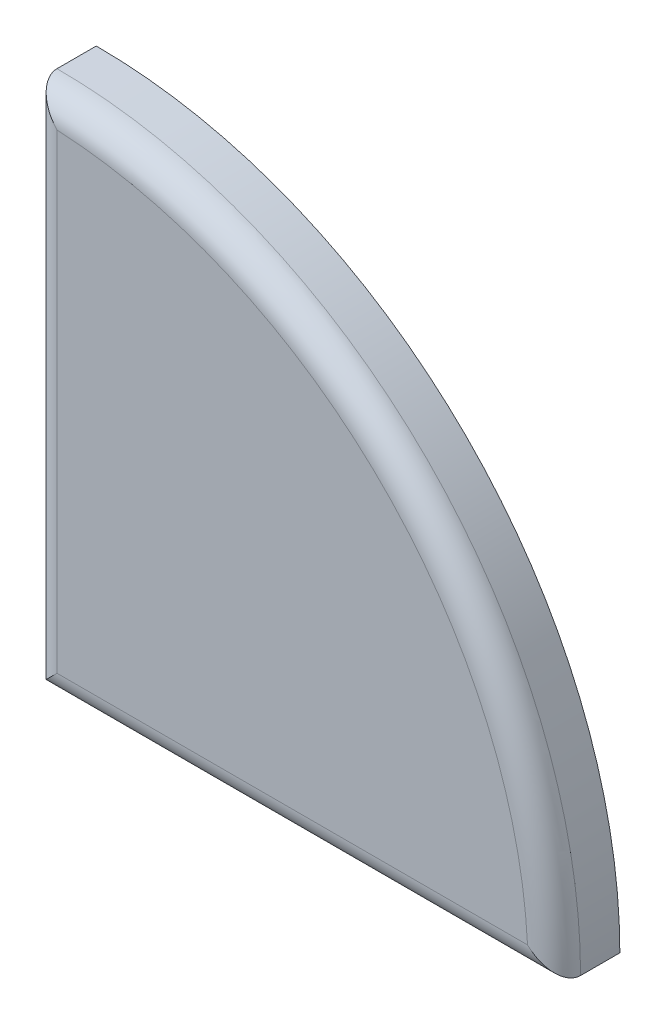
ISO-10303-21;
HEADER;
FILE_DESCRIPTION(('STEP AP214'),'2;1');
FILE_NAME('part.step','',(''),(''),'','','');
FILE_SCHEMA(('AUTOMOTIVE_DESIGN { 1 0 10303 214 1 1 1 1 }'));
ENDSEC;
DATA;
#1=APPLICATION_CONTEXT('core data for automotive mechanical design processes');
#2=APPLICATION_PROTOCOL_DEFINITION('international standard','automotive_design',2000,#1);
#3=PRODUCT_CONTEXT('',#1,'mechanical');
#4=PRODUCT('Part','Part','',(#3));
#5=PRODUCT_RELATED_PRODUCT_CATEGORY('part','',(#4));
#6=PRODUCT_DEFINITION_FORMATION('','',#4);
#7=PRODUCT_DEFINITION_CONTEXT('part definition',#1,'design');
#8=PRODUCT_DEFINITION('design','',#6,#7);
#9=PRODUCT_DEFINITION_SHAPE('','',#8);
#10=(LENGTH_UNIT() NAMED_UNIT(*) SI_UNIT(.MILLI.,.METRE.));
#11=(NAMED_UNIT(*) PLANE_ANGLE_UNIT() SI_UNIT($,.RADIAN.));
#12=(NAMED_UNIT(*) SI_UNIT($,.STERADIAN.) SOLID_ANGLE_UNIT());
#13=UNCERTAINTY_MEASURE_WITH_UNIT(LENGTH_MEASURE(1.E-05),#10,'distance_accuracy_value','');
#14=(GEOMETRIC_REPRESENTATION_CONTEXT(3) GLOBAL_UNCERTAINTY_ASSIGNED_CONTEXT((#13)) GLOBAL_UNIT_ASSIGNED_CONTEXT((#10,
#11,#12)) REPRESENTATION_CONTEXT('',''));
#15=CARTESIAN_POINT('',(0.,0.,0.));
#16=DIRECTION('',(0.,0.,1.));
#17=DIRECTION('',(1.,0.,0.));
#18=AXIS2_PLACEMENT_3D('',#15,#16,#17);
#19=CARTESIAN_POINT('',(-20.,-20.,5.));
#20=DIRECTION('',(0.,0.,-1.));
#21=DIRECTION('',(-1.,0.,0.));
#22=AXIS2_PLACEMENT_3D('',#19,#20,#21);
#23=CYLINDRICAL_SURFACE('',#22,40.);
#24=DIRECTION('',(0.,0.,-1.));
#25=VECTOR('',#24,1.);
#26=CARTESIAN_POINT('',(-20.,20.,5.));
#27=LINE('',#26,#25);
#28=CARTESIAN_POINT('',(-20.,20.,3.));
#29=VERTEX_POINT('',#28);
#30=CARTESIAN_POINT('',(-20.,20.,0.));
#31=VERTEX_POINT('',#30);
#32=EDGE_CURVE('E41',#29,#31,#27,.T.);
#33=ORIENTED_EDGE('',*,*,#32,.F.);
#34=CARTESIAN_POINT('',(-20.,-20.,3.));
#35=DIRECTION('',(0.,0.,-1.));
#36=DIRECTION('',(-1.,0.,0.));
#37=AXIS2_PLACEMENT_3D('',#34,#35,#36);
#38=CIRCLE('',#37,40.);
#39=CARTESIAN_POINT('',(20.,-20.,3.));
#40=VERTEX_POINT('',#39);
#41=EDGE_CURVE('E11',#29,#40,#38,.T.);
#42=ORIENTED_EDGE('',*,*,#41,.T.);
#43=DIRECTION('',(0.,0.,-1.));
#44=VECTOR('',#43,1.);
#45=CARTESIAN_POINT('',(20.,-20.,5.));
#46=LINE('',#45,#44);
#47=CARTESIAN_POINT('',(20.,-20.,0.));
#48=VERTEX_POINT('',#47);
#49=EDGE_CURVE('E28',#40,#48,#46,.T.);
#50=ORIENTED_EDGE('',*,*,#49,.T.);
#51=CARTESIAN_POINT('',(-20.,-20.,0.));
#52=DIRECTION('',(0.,0.,1.));
#53=DIRECTION('',(-1.,0.,0.));
#54=AXIS2_PLACEMENT_3D('',#51,#52,#53);
#55=CIRCLE('',#54,40.);
#56=EDGE_CURVE('E93',#48,#31,#55,.T.);
#57=ORIENTED_EDGE('',*,*,#56,.T.);
#58=EDGE_LOOP('',(#33,#42,#50,#57));
#59=FACE_BOUND('',#58,.T.);
#60=ADVANCED_FACE('F16',(#59),#23,.T.);
#61=CARTESIAN_POINT('',(-20.,-20.,5.));
#62=DIRECTION('',(1.,0.,0.));
#63=DIRECTION('',(0.,1.,0.));
#64=AXIS2_PLACEMENT_3D('',#61,#62,#63);
#65=PLANE('',#64);
#66=DIRECTION('',(0.,0.,-1.));
#67=VECTOR('',#66,1.);
#68=CARTESIAN_POINT('',(-20.,-20.,5.));
#69=LINE('',#68,#67);
#70=CARTESIAN_POINT('',(-20.,-20.,3.));
#71=VERTEX_POINT('',#70);
#72=CARTESIAN_POINT('',(-20.,-20.,0.));
#73=VERTEX_POINT('',#72);
#74=EDGE_CURVE('E75',#71,#73,#69,.T.);
#75=ORIENTED_EDGE('',*,*,#74,.F.);
#76=DIRECTION('',(0.,1.,0.));
#77=VECTOR('',#76,1.);
#78=CARTESIAN_POINT('',(-20.,-20.,3.));
#79=LINE('',#78,#77);
#80=EDGE_CURVE('E356',#71,#29,#79,.T.);
#81=ORIENTED_EDGE('',*,*,#80,.T.);
#82=ORIENTED_EDGE('',*,*,#32,.T.);
#83=DIRECTION('',(0.,-1.,0.));
#84=VECTOR('',#83,1.);
#85=CARTESIAN_POINT('',(-20.,-20.,0.));
#86=LINE('',#85,#84);
#87=EDGE_CURVE('E87',#31,#73,#86,.T.);
#88=ORIENTED_EDGE('',*,*,#87,.T.);
#89=EDGE_LOOP('',(#75,#81,#82,#88));
#90=FACE_BOUND('',#89,.T.);
#91=ADVANCED_FACE('F88',(#90),#65,.F.);
#92=CARTESIAN_POINT('',(20.,-20.,5.));
#93=DIRECTION('',(0.,1.,0.));
#94=DIRECTION('',(1.,0.,0.));
#95=AXIS2_PLACEMENT_3D('',#92,#93,#94);
#96=PLANE('',#95);
#97=ORIENTED_EDGE('',*,*,#49,.F.);
#98=DIRECTION('',(-1.,0.,0.));
#99=VECTOR('',#98,1.);
#100=CARTESIAN_POINT('',(20.,-20.,3.));
#101=LINE('',#100,#99);
#102=EDGE_CURVE('E81',#40,#71,#101,.T.);
#103=ORIENTED_EDGE('',*,*,#102,.T.);
#104=ORIENTED_EDGE('',*,*,#74,.T.);
#105=DIRECTION('',(1.,0.,0.));
#106=VECTOR('',#105,1.);
#107=CARTESIAN_POINT('',(20.,-20.,0.));
#108=LINE('',#107,#106);
#109=EDGE_CURVE('E80',#73,#48,#108,.T.);
#110=ORIENTED_EDGE('',*,*,#109,.T.);
#111=EDGE_LOOP('',(#97,#103,#104,#110));
#112=FACE_BOUND('',#111,.T.);
#113=ADVANCED_FACE('F78',(#112),#96,.F.);
#114=CARTESIAN_POINT('',(-20.,-20.,5.));
#115=DIRECTION('',(0.,0.,-1.));
#116=DIRECTION('',(0.,-1.,0.));
#117=AXIS2_PLACEMENT_3D('',#114,#115,#116);
#118=PLANE('',#117);
#119=DIRECTION('',(0.,-1.,0.));
#120=VECTOR('',#119,1.);
#121=CARTESIAN_POINT('',(-18.,-20.,5.));
#122=LINE('',#121,#120);
#123=CARTESIAN_POINT('',(-18.,17.9473319220205,5.));
#124=VERTEX_POINT('',#123);
#125=CARTESIAN_POINT('',(-18.,-18.,5.));
#126=VERTEX_POINT('',#125);
#127=EDGE_CURVE('E96',#124,#126,#122,.T.);
#128=ORIENTED_EDGE('',*,*,#127,.T.);
#129=DIRECTION('',(1.,0.,0.));
#130=VECTOR('',#129,1.);
#131=CARTESIAN_POINT('',(-20.,-18.,5.));
#132=LINE('',#131,#130);
#133=CARTESIAN_POINT('',(17.9473319220205,-18.,5.));
#134=VERTEX_POINT('',#133);
#135=EDGE_CURVE('E103',#126,#134,#132,.T.);
#136=ORIENTED_EDGE('',*,*,#135,.T.);
#137=CARTESIAN_POINT('',(-20.,-20.,5.));
#138=DIRECTION('',(0.,0.,1.));
#139=DIRECTION('',(-1.,0.,0.));
#140=AXIS2_PLACEMENT_3D('',#137,#138,#139);
#141=CIRCLE('',#140,38.);
#142=EDGE_CURVE('E150',#134,#124,#141,.T.);
#143=ORIENTED_EDGE('',*,*,#142,.T.);
#144=EDGE_LOOP('',(#128,#136,#143));
#145=FACE_BOUND('',#144,.T.);
#146=ADVANCED_FACE('F127',(#145),#118,.F.);
#147=CARTESIAN_POINT('',(-20.,-20.,0.));
#148=DIRECTION('',(0.,0.,-1.));
#149=DIRECTION('',(0.,-1.,0.));
#150=AXIS2_PLACEMENT_3D('',#147,#148,#149);
#151=PLANE('',#150);
#152=ORIENTED_EDGE('',*,*,#56,.F.);
#153=ORIENTED_EDGE('',*,*,#109,.F.);
#154=ORIENTED_EDGE('',*,*,#87,.F.);
#155=EDGE_LOOP('',(#152,#153,#154));
#156=FACE_BOUND('',#155,.T.);
#157=ADVANCED_FACE('F92',(#156),#151,.T.);
#158=CARTESIAN_POINT('',(-18.,-20.,3.));
#159=DIRECTION('',(0.,-1.,0.));
#160=DIRECTION('',(0.,0.,-1.));
#161=AXIS2_PLACEMENT_3D('',#158,#159,#160);
#162=CYLINDRICAL_SURFACE('',#161,2.);
#163=CARTESIAN_POINT('',(-18.,-18.,5.));
#164=CARTESIAN_POINT('',(-19.1715728752538,-19.1715728752538,5.00000000000001));
#165=CARTESIAN_POINT('',(-20.,-20.,4.17157287525381));
#166=CARTESIAN_POINT('',(-20.,-20.,3.));
#167=(BOUNDED_CURVE() B_SPLINE_CURVE(3,(#163,#164,#165,#166),.UNSPECIFIED.,.F.,
.F.) B_SPLINE_CURVE_WITH_KNOTS((4,4),(4.71238898038469,6.28318530717959),
.UNSPECIFIED.) CURVE() GEOMETRIC_REPRESENTATION_ITEM() RATIONAL_B_SPLINE_CURVE((1.,
0.804737854124365,0.804737854124365,1.)) REPRESENTATION_ITEM(''));
#168=EDGE_CURVE('E163',#126,#71,#167,.T.);
#169=ORIENTED_EDGE('',*,*,#168,.F.);
#170=ORIENTED_EDGE('',*,*,#127,.F.);
#171=CARTESIAN_POINT('',(-20.0000000000001,20.,3.));
#172=CARTESIAN_POINT('',(-20.0000003530414,20.000000401746,3.01922782404628));
#173=CARTESIAN_POINT('',(-19.9997189131085,19.9997227338852,3.0384554570293));
#174=CARTESIAN_POINT('',(-19.9985964164672,19.9986127672637,3.07692685774793));
#175=CARTESIAN_POINT('',(-19.9977539532661,19.9977790745332,3.09617054432251));
#176=CARTESIAN_POINT('',(-19.9955096741128,19.9955548697261,3.13465785350083));
#177=CARTESIAN_POINT('',(-19.9941059931842,19.9941625010642,3.15390125978837));
#178=CARTESIAN_POINT('',(-19.9907401948945,19.9908197417427,3.19237188352495));
#179=CARTESIAN_POINT('',(-19.98877577393,19.9888670490109,3.21159869906074));
#180=CARTESIAN_POINT('',(-19.9842893924962,19.9844026662456,3.25001990455247));
#181=CARTESIAN_POINT('',(-19.9817647120339,19.9818882486913,3.26921365945341));
#182=CARTESIAN_POINT('',(-19.9761588645809,19.9762998742359,3.30755245774012));
#183=CARTESIAN_POINT('',(-19.9730745879879,19.9732227898799,3.32669658987219));
#184=CARTESIAN_POINT('',(-19.9663507051737,19.9665089197757,3.36491980272752));
#185=CARTESIAN_POINT('',(-19.9627076294995,19.9628686359397,3.38399765778847));
#186=CARTESIAN_POINT('',(-19.9548674189808,19.9550286017776,3.42207193565066));
#187=CARTESIAN_POINT('',(-19.9506664871833,19.9508250154582,3.44106678556811));
#188=CARTESIAN_POINT('',(-19.9417119418676,19.9418590066641,3.47895863929594));
#189=CARTESIAN_POINT('',(-19.9369542380451,19.937092445603,3.49785369584799));
#190=CARTESIAN_POINT('',(-19.9268876315531,19.9270015169631,3.53552952546439));
#191=CARTESIAN_POINT('',(-19.9215743805146,19.9216727453949,3.55430795553573));
#192=CARTESIAN_POINT('',(-19.9103982649792,19.9104588278391,3.59173407998057));
#193=CARTESIAN_POINT('',(-19.9045308298005,19.9045690507987,3.6103790200202));
#194=CARTESIAN_POINT('',(-19.8922480335532,19.8922349595548,3.64752170871918));
#195=CARTESIAN_POINT('',(-19.8858279151198,19.8857858260368,3.6660162817041));
#196=CARTESIAN_POINT('',(-19.8724415347049,19.8723352714667,3.70284178047072));
#197=CARTESIAN_POINT('',(-19.865470363567,19.865328881522,3.72116910447644));
#198=CARTESIAN_POINT('',(-19.8509837751553,19.8507664670058,3.75764368518888));
#199=CARTESIAN_POINT('',(-19.8434633308987,19.843205361807,3.77578691444813));
#200=CARTESIAN_POINT('',(-19.8278801249945,19.8275366265757,3.81187683653801));
#201=CARTESIAN_POINT('',(-19.8198122500605,19.8194238413863,3.82981908011604));
#202=CARTESIAN_POINT('',(-19.8031364542458,19.8026551289602,3.86549088846551));
#203=CARTESIAN_POINT('',(-19.794523366982,19.7939940055417,3.88321559415834));
#204=CARTESIAN_POINT('',(-19.778280853032,19.7776635157122,3.9154171487041));
#205=CARTESIAN_POINT('',(-19.7707153660614,19.7700580267246,3.92995876529487));
#206=CARTESIAN_POINT('',(-19.7551875492616,19.7544480089341,3.95892812524978));
#207=CARTESIAN_POINT('',(-19.7472211732077,19.7464394111451,3.97335149879901));
#208=CARTESIAN_POINT('',(-19.7225570552454,19.7216398108257,4.01673632721694));
#209=CARTESIAN_POINT('',(-19.7054109327426,19.7043930884818,4.04518588922929));
#210=CARTESIAN_POINT('',(-19.6695657669917,19.6683073510316,4.10150626253239));
#211=CARTESIAN_POINT('',(-19.6508364055032,19.6494369780575,4.12933752115913));
#212=CARTESIAN_POINT('',(-19.6118358074021,19.6101002986542,4.18432813255376));
#213=CARTESIAN_POINT('',(-19.5915357684464,19.5896037567479,4.21144538536442));
#214=CARTESIAN_POINT('',(-19.5494074895562,19.5470181186065,4.26490941765051));
#215=CARTESIAN_POINT('',(-19.5275521162227,19.5249002046236,4.29121178054695));
#216=CARTESIAN_POINT('',(-19.4823274221411,19.4790802213692,4.34294652243371));
#217=CARTESIAN_POINT('',(-19.4589326792866,19.4553509367873,4.36833250531974));
#218=CARTESIAN_POINT('',(-19.4106441774729,19.4063232333309,4.418132772932));
#219=CARTESIAN_POINT('',(-19.3857267134045,19.3809993871215,4.442498953204));
#220=CARTESIAN_POINT('',(-19.3344100197857,19.3288017616622,4.49015850778918));
#221=CARTESIAN_POINT('',(-19.3079888241711,19.3019044197295,4.51340238898703));
#222=CARTESIAN_POINT('',(-19.2596127678186,19.2526385492704,4.55375748646061));
#223=CARTESIAN_POINT('',(-19.2377847577049,19.2304026481904,4.57118416572252));
#224=CARTESIAN_POINT('',(-19.1929529162002,19.1847049797378,4.6054763456639));
#225=CARTESIAN_POINT('',(-19.1699345066273,19.161227392668,4.62230170697647));
#226=CARTESIAN_POINT('',(-19.1227356665227,19.1130374481434,4.65530244278469));
#227=CARTESIAN_POINT('',(-19.098542148254,19.0883100803246,4.67143712518097));
#228=CARTESIAN_POINT('',(-19.0490052314554,19.0376175090946,4.70296431626886));
#229=CARTESIAN_POINT('',(-19.0236500342238,19.0116382100506,4.71831558593465));
#230=CARTESIAN_POINT('',(-18.9718031151775,18.9584444439023,4.74818113674782));
#231=CARTESIAN_POINT('',(-18.9453007939041,18.9312168839131,4.76265365528867));
#232=CARTESIAN_POINT('',(-18.8911737549364,18.8755351114911,4.7906646125666));
#233=CARTESIAN_POINT('',(-18.8635395420632,18.8470688886205,4.80416079190691));
#234=CARTESIAN_POINT('',(-18.8071617419769,18.7889265825368,4.83011940305845));
#235=CARTESIAN_POINT('',(-18.7784096224162,18.7592397126106,4.84253908949515));
#236=CARTESIAN_POINT('',(-18.7198156160844,18.6986736533041,4.86624562457384));
#237=CARTESIAN_POINT('',(-18.6899662558907,18.6677848068787,4.87748933919712));
#238=CARTESIAN_POINT('',(-18.6378306442569,18.6138249995317,4.8957095512916));
#239=CARTESIAN_POINT('',(-18.6156016955656,18.5908155802924,4.90303427739044));
#240=CARTESIAN_POINT('',(-18.5696024943063,18.5431828796015,4.91730210492352));
#241=CARTESIAN_POINT('',(-18.5458247184061,18.5185506293673,4.92419070918392));
#242=CARTESIAN_POINT('',(-18.4700698297297,18.4399779487889,4.94464173891959));
#243=CARTESIAN_POINT('',(-18.4179193098377,18.3857452394241,4.95648976586652));
#244=CARTESIAN_POINT('',(-18.3374074214568,18.3017396291658,4.97147665681077));
#245=CARTESIAN_POINT('',(-18.3091097068518,18.2721610093912,4.97611725459357));
#246=CARTESIAN_POINT('',(-18.2510486154289,18.2113743279598,4.98436880796523));
#247=CARTESIAN_POINT('',(-18.2212832993686,18.1801593250367,4.98791602840609));
#248=CARTESIAN_POINT('',(-18.1603098449511,18.1161279864272,4.99379792989832));
#249=CARTESIAN_POINT('',(-18.1291007994121,18.083306478343,4.99606649064867));
#250=CARTESIAN_POINT('',(-18.0652590713767,18.0161047032148,4.99920172037853));
#251=CARTESIAN_POINT('',(-18.0326261843508,17.9817214214673,4.9999999517581));
#252=CARTESIAN_POINT('',(-18.,17.9473319220205,5.));
#253=B_SPLINE_CURVE_WITH_KNOTS('',3,(#171,#172,#173,#174,#175,#176,#177,#178,#179,#180,#181,
#182,#183,#184,#185,#186,#187,#188,#189,#190,#191,#192,#193,#194,#195,#196,#197,#198,#199,#200,
#201,#202,#203,#204,#205,#206,#207,#208,#209,#210,#211,#212,#213,#214,#215,#216,#217,#218,#219,
#220,#221,#222,#223,#224,#225,#226,#227,#228,#229,#230,#231,#232,#233,#234,#235,#236,#237,#238,
#239,#240,#241,#242,#243,#244,#245,#246,#247,#248,#249,#250,#251,#252),.UNSPECIFIED.,.F.,.F.,(4,
2,2,2,2,2,2,2,2,2,2,2,2,2,2,2,2,2,2,2,2,2,2,2,2,2,2,2,2,2,2,2,2,2,2,2,2,2,2,2,4),(0.,
0.0576791203137053,0.115503390079609,0.17352143372772,0.231781341718507,0.29033053556855,
0.349215641041506,0.40848237077527,0.46817541736162,0.528338357628255,0.58901356860652,
0.650242155411202,0.712063891020514,0.774517167731268,0.837638959880915,0.901464797277147,
0.966028748657783,1.02023229014718,1.07518689278062,1.18740487768101,1.30281853012799,
1.42153905515939,1.5436652153926,1.66928419840689,1.79847247302554,1.93129662164965,
2.03837743929528,2.14915476696825,2.26364533364447,2.38186170821726,2.50381271313139,
2.62950379541635,2.75893736357993,2.89211309758472,2.9905647804706,3.09532267698086,
3.32367100242319,3.44724774921804,3.57705716393878,3.71307616046703,3.85528021855188),.UNSPECIFIED.);
#254=EDGE_CURVE('E112',#29,#124,#253,.T.);
#255=ORIENTED_EDGE('',*,*,#254,.F.);
#256=ORIENTED_EDGE('',*,*,#80,.F.);
#257=EDGE_LOOP('',(#169,#170,#255,#256));
#258=FACE_BOUND('',#257,.T.);
#259=ADVANCED_FACE('F18',(#258),#162,.T.);
#260=CARTESIAN_POINT('',(-20.,-20.,3.));
#261=DIRECTION('',(0.,0.,-1.));
#262=DIRECTION('',(-1.,0.,0.));
#263=AXIS2_PLACEMENT_3D('',#260,#261,#262);
#264=TOROIDAL_SURFACE('',#263,38.,2.);
#265=ORIENTED_EDGE('',*,*,#254,.T.);
#266=ORIENTED_EDGE('',*,*,#142,.F.);
#267=CARTESIAN_POINT('',(20.,-20.,3.));
#268=CARTESIAN_POINT('',(20.0000003238103,-20.0000004108245,3.01917812633304));
#269=CARTESIAN_POINT('',(19.9997195680258,-19.999724165756,3.03835604705108));
#270=CARTESIAN_POINT('',(19.9986000525822,-19.9986197542133,3.07673477849676));
#271=CARTESIAN_POINT('',(19.9977596960351,-19.9977900082461,3.09593549730761));
#272=CARTESIAN_POINT('',(19.9955210630415,-19.9955759267909,3.13434371328234));
#273=CARTESIAN_POINT('',(19.9941207351656,-19.9941895520426,3.15355097300408));
#274=CARTESIAN_POINT('',(19.9907627100052,-19.990860609958,3.19195621012576));
#275=CARTESIAN_POINT('',(19.9888025267129,-19.9889155616388,3.21115375473192));
#276=CARTESIAN_POINT('',(19.9843251916458,-19.9844679604225,3.24952335255108));
#277=CARTESIAN_POINT('',(19.9818051409317,-19.9819625053169,3.26869473051722));
#278=CARTESIAN_POINT('',(19.9762084834794,-19.9763932818359,3.30699570369946));
#279=CARTESIAN_POINT('',(19.9731285904554,-19.9733262159672,3.3261243384873));
#280=CARTESIAN_POINT('',(19.9664126249298,-19.9666334125584,3.36432344590828));
#281=CARTESIAN_POINT('',(19.9627729068256,-19.9630040118445,3.3833926348165));
#282=CARTESIAN_POINT('',(19.9549376412852,-19.9551866494392,3.42145639642127));
#283=CARTESIAN_POINT('',(19.9507381190976,-19.9509946918668,3.44044932909826));
#284=CARTESIAN_POINT('',(19.941783564006,-19.9420527953558,3.47834405767186));
#285=CARTESIAN_POINT('',(19.9370242588119,-19.937298563362,3.49724382959386));
#286=CARTESIAN_POINT('',(19.9269504245299,-19.9272331717896,3.5349356594369));
#287=CARTESIAN_POINT('',(19.9216313581044,-19.9219174594122,3.55372528722175));
#288=CARTESIAN_POINT('',(19.9104382550258,-19.9107306394879,3.59118020402377));
#289=CARTESIAN_POINT('',(19.9045594487898,-19.9048547580427,3.60984263995213));
#290=CARTESIAN_POINT('',(19.8922470882469,-19.8925496148301,3.64702651279028));
#291=CARTESIAN_POINT('',(19.8858085647373,-19.8861153972737,3.66554466215831));
#292=CARTESIAN_POINT('',(19.8723769541595,-19.8726960878735,3.70242326937447));
#293=CARTESIAN_POINT('',(19.8653787301793,-19.8657058975851,3.72077999867387));
#294=CARTESIAN_POINT('',(19.850827890903,-19.8511776303458,3.75731908006991));
#295=CARTESIAN_POINT('',(19.8432700021216,-19.8436343508359,3.77549726104797));
#296=CARTESIAN_POINT('',(19.8275999011872,-19.8280034349147,3.81166247299075));
#297=CARTESIAN_POINT('',(19.8194823076987,-19.8199105300056,3.82964489181415));
#298=CARTESIAN_POINT('',(19.8026931162119,-19.8031842295464,3.86540213350109));
#299=CARTESIAN_POINT('',(19.7940160602674,-19.7945455339002,3.88317191331256));
#300=CARTESIAN_POINT('',(19.7777171661413,-19.7783340223704,3.91531151670816));
#301=CARTESIAN_POINT('',(19.7701640276404,-19.7708270186842,3.92974951117107));
#302=CARTESIAN_POINT('',(19.7546508587789,-19.7554184298505,3.95852830075427));
#303=CARTESIAN_POINT('',(19.7466864562796,-19.7475126449265,3.97286448170217));
#304=CARTESIAN_POINT('',(19.7219992762549,-19.7230182731405,4.01603096998529));
#305=CARTESIAN_POINT('',(19.7048205326777,-19.7059886869519,4.0443537223093));
#306=CARTESIAN_POINT('',(19.6688528618544,-19.6703518064895,4.10048330522015));
#307=CARTESIAN_POINT('',(19.6500308730574,-19.6517122995758,4.1282483249527));
#308=CARTESIAN_POINT('',(19.6107740680896,-19.612850457375,4.18316488469398));
#309=CARTESIAN_POINT('',(19.5903075567023,-19.592597172621,4.21027181984121));
#310=CARTESIAN_POINT('',(19.5477606110254,-19.5505105182372,4.26376841764082));
#311=CARTESIAN_POINT('',(19.5256499725253,-19.5286477791616,4.29011086660998));
#312=CARTESIAN_POINT('',(19.479813270074,-19.4833509116826,4.34197289968895));
#313=CARTESIAN_POINT('',(19.4560585128946,-19.4598892015897,4.36744296153124));
#314=CARTESIAN_POINT('',(19.4069317145683,-19.4114108353021,4.41745150397608));
#315=CARTESIAN_POINT('',(19.381532479601,-19.3863686048605,4.44193838608576));
#316=CARTESIAN_POINT('',(19.3291166789097,-19.3347505444528,4.48987191693693));
#317=CARTESIAN_POINT('',(19.3020744478691,-19.3081512429862,4.51326519218522));
#318=CARTESIAN_POINT('',(19.2529187004251,-19.2598914488029,4.55352636276939));
#319=CARTESIAN_POINT('',(19.2309564207545,-19.2383607322842,4.57073616655536));
#320=CARTESIAN_POINT('',(19.185727345472,-19.1940715529351,4.60468101575123));
#321=CARTESIAN_POINT('',(19.1624428507957,-19.1712977037276,4.62137240825302));
#322=CARTESIAN_POINT('',(19.1145700563515,-19.1245111555952,4.65418292987895));
#323=CARTESIAN_POINT('',(19.0899655051818,-19.1004839167183,4.67025755385417));
#324=CARTESIAN_POINT('',(19.0394507149911,-19.0511862806165,4.70173242821598));
#325=CARTESIAN_POINT('',(19.0135254305307,-19.0259023440103,4.71708728790259));
#326=CARTESIAN_POINT('',(18.9603680508438,-18.974093597067,4.74701682437329));
#327=CARTESIAN_POINT('',(18.9331220205489,-18.9475563756508,4.76154522193197));
#328=CARTESIAN_POINT('',(18.8773225272663,-18.8932499941624,4.78971271757272));
#329=CARTESIAN_POINT('',(18.8487561459949,-18.8654696651139,4.80330465415134));
#330=CARTESIAN_POINT('',(18.7903130974458,-18.8086963481347,4.82948617508643));
#331=CARTESIAN_POINT('',(18.7604243553106,-18.7796936554405,4.84202769668543));
#332=CARTESIAN_POINT('',(18.6993431955146,-18.7204933591613,4.8659960239689));
#333=CARTESIAN_POINT('',(18.6681397692126,-18.6902873287855,4.87737399464142));
#334=CARTESIAN_POINT('',(18.6151458739471,-18.6391219419715,4.89526043276424));
#335=CARTESIAN_POINT('',(18.5934479477827,-18.618210284951,4.90218239707142));
#336=CARTESIAN_POINT('',(18.5480528612392,-18.5745278399918,4.91585103150183));
#337=CARTESIAN_POINT('',(18.5243427136497,-18.551750293505,4.92253264634771));
#338=CARTESIAN_POINT('',(18.4474205581517,-18.4778984024137,4.94278476740628));
#339=CARTESIAN_POINT('',(18.3939434963247,-18.4266245860156,4.95466996003295));
#340=CARTESIAN_POINT('',(18.3105923926557,-18.3467544065947,4.96992355242738));
#341=CARTESIAN_POINT('',(18.2808592753186,-18.3182721973606,4.97472364293727));
#342=CARTESIAN_POINT('',(18.2193897348825,-18.2594234360827,4.9833404190314));
#343=CARTESIAN_POINT('',(18.187646125706,-18.2290522051498,4.98707518431869));
#344=CARTESIAN_POINT('',(18.1221571487481,-18.1664591865931,4.99332354763033));
#345=CARTESIAN_POINT('',(18.0884055689926,-18.1342353213575,4.99575078576968));
#346=CARTESIAN_POINT('',(18.0188984739235,-18.0679912405123,4.99913441145012));
#347=CARTESIAN_POINT('',(17.9831373423996,-18.0339722577442,5.00000008016545));
#348=CARTESIAN_POINT('',(17.9473319220205,-18.,5.));
#349=B_SPLINE_CURVE_WITH_KNOTS('',3,(#267,#268,#269,#270,#271,#272,#273,#274,#275,#276,#277,
#278,#279,#280,#281,#282,#283,#284,#285,#286,#287,#288,#289,#290,#291,#292,#293,#294,#295,#296,
#297,#298,#299,#300,#301,#302,#303,#304,#305,#306,#307,#308,#309,#310,#311,#312,#313,#314,#315,
#316,#317,#318,#319,#320,#321,#322,#323,#324,#325,#326,#327,#328,#329,#330,#331,#332,#333,#334,
#335,#336,#337,#338,#339,#340,#341,#342,#343,#344,#345,#346,#347,#348),.UNSPECIFIED.,.F.,.F.,(4,
2,2,2,2,2,2,2,2,2,2,2,2,2,2,2,2,2,2,2,2,2,2,2,2,2,2,2,2,2,2,2,2,2,2,2,2,2,2,2,4),(0.,
0.057530027027147,0.115224930457088,0.173133161797645,0.231302639492592,0.289780639772004,
0.348613695115707,0.407847501244011,0.467526833334316,0.527695471942212,0.588396138890346,
0.649670443184733,0.711558836832652,0.774100580273171,0.837333716993518,0.901295056793555,
0.966020167076205,1.01983415495881,1.07444593528059,1.1861215500018,1.30118971144302,
1.41977070852958,1.54197445690312,1.66790138583974,1.7976432785656,1.9312840579671,
2.03699168416299,2.14676114798971,2.26062121606031,2.37859766125818,2.50071364870811,
2.62699006393047,2.75744579280904,2.89209796128099,2.98484710721804,3.08548980903473,
3.31044852360267,3.43479239701316,3.56704138661041,3.70719715399989,3.85526107295977),.UNSPECIFIED.);
#350=EDGE_CURVE('E172',#40,#134,#349,.T.);
#351=ORIENTED_EDGE('',*,*,#350,.F.);
#352=ORIENTED_EDGE('',*,*,#41,.F.);
#353=EDGE_LOOP('',(#265,#266,#351,#352));
#354=FACE_BOUND('',#353,.T.);
#355=ADVANCED_FACE('F117',(#354),#264,.T.);
#356=CARTESIAN_POINT('',(-20.,-18.,3.));
#357=DIRECTION('',(1.,0.,0.));
#358=DIRECTION('',(0.,1.,0.));
#359=AXIS2_PLACEMENT_3D('',#356,#357,#358);
#360=CYLINDRICAL_SURFACE('',#359,2.);
#361=ORIENTED_EDGE('',*,*,#168,.T.);
#362=ORIENTED_EDGE('',*,*,#102,.F.);
#363=ORIENTED_EDGE('',*,*,#350,.T.);
#364=ORIENTED_EDGE('',*,*,#135,.F.);
#365=EDGE_LOOP('',(#361,#362,#363,#364));
#366=FACE_BOUND('',#365,.T.);
#367=ADVANCED_FACE('F126',(#366),#360,.T.);
#368=CLOSED_SHELL('',(#60,#91,#113,#146,#157,#259,#355,#367));
#369=MANIFOLD_SOLID_BREP('B1',#368);
#370=ADVANCED_BREP_SHAPE_REPRESENTATION('',(#18,#369),#14);
#371=SHAPE_DEFINITION_REPRESENTATION(#9,#370);
ENDSEC;
END-ISO-10303-21;
